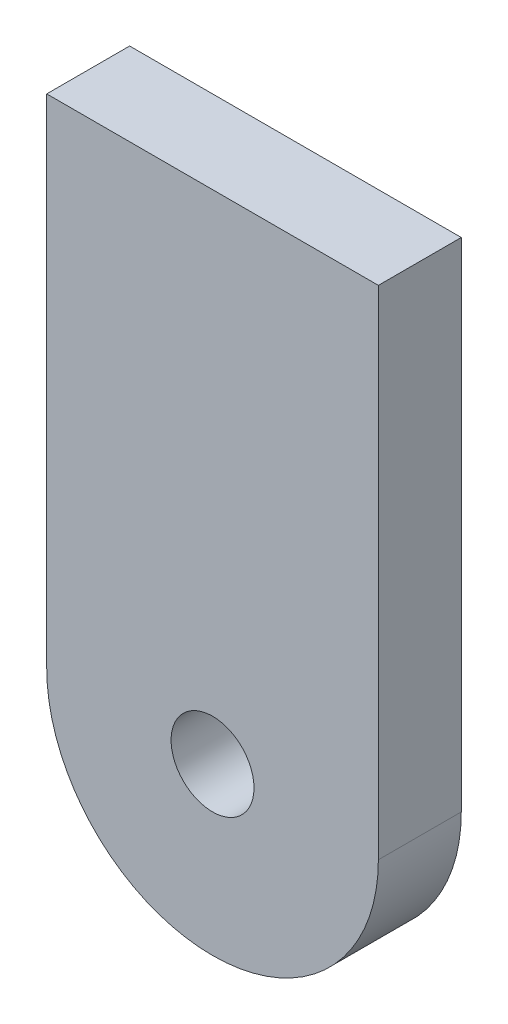
ISO-10303-21;
HEADER;
FILE_DESCRIPTION(('STEP AP214'),'2;1');
FILE_NAME('part.step','',(''),(''),'','','');
FILE_SCHEMA(('AUTOMOTIVE_DESIGN { 1 0 10303 214 1 1 1 1 }'));
ENDSEC;
DATA;
#1=APPLICATION_CONTEXT('core data for automotive mechanical design processes');
#2=APPLICATION_PROTOCOL_DEFINITION('international standard','automotive_design',2000,#1);
#3=PRODUCT_CONTEXT('',#1,'mechanical');
#4=PRODUCT('Part','Part','',(#3));
#5=PRODUCT_RELATED_PRODUCT_CATEGORY('part','',(#4));
#6=PRODUCT_DEFINITION_FORMATION('','',#4);
#7=PRODUCT_DEFINITION_CONTEXT('part definition',#1,'design');
#8=PRODUCT_DEFINITION('design','',#6,#7);
#9=PRODUCT_DEFINITION_SHAPE('','',#8);
#10=(LENGTH_UNIT() NAMED_UNIT(*) SI_UNIT(.MILLI.,.METRE.));
#11=(NAMED_UNIT(*) PLANE_ANGLE_UNIT() SI_UNIT($,.RADIAN.));
#12=(NAMED_UNIT(*) SI_UNIT($,.STERADIAN.) SOLID_ANGLE_UNIT());
#13=UNCERTAINTY_MEASURE_WITH_UNIT(LENGTH_MEASURE(1.E-05),#10,'distance_accuracy_value','');
#14=(GEOMETRIC_REPRESENTATION_CONTEXT(3) GLOBAL_UNCERTAINTY_ASSIGNED_CONTEXT((#13)) GLOBAL_UNIT_ASSIGNED_CONTEXT((#10,
#11,#12)) REPRESENTATION_CONTEXT('',''));
#15=CARTESIAN_POINT('',(0.,0.,0.));
#16=DIRECTION('',(0.,0.,1.));
#17=DIRECTION('',(1.,0.,0.));
#18=AXIS2_PLACEMENT_3D('',#15,#16,#17);
#19=CARTESIAN_POINT('',(0.,0.,2.5));
#20=DIRECTION('',(0.,0.,1.));
#21=DIRECTION('',(1.,0.,0.));
#22=AXIS2_PLACEMENT_3D('',#19,#20,#21);
#23=PLANE('',#22);
#24=CARTESIAN_POINT('',(0.,0.,2.5));
#25=DIRECTION('',(0.,0.,1.));
#26=DIRECTION('',(1.,0.,0.));
#27=AXIS2_PLACEMENT_3D('',#24,#25,#26);
#28=CIRCLE('',#27,10.);
#29=CARTESIAN_POINT('',(-10.,0.,2.5));
#30=VERTEX_POINT('',#29);
#31=CARTESIAN_POINT('',(10.,0.,2.5));
#32=VERTEX_POINT('',#31);
#33=EDGE_CURVE('E91',#30,#32,#28,.T.);
#34=ORIENTED_EDGE('',*,*,#33,.T.);
#35=DIRECTION('',(0.,1.,0.));
#36=VECTOR('',#35,1.);
#37=CARTESIAN_POINT('',(10.,0.,2.5));
#38=LINE('',#37,#36);
#39=CARTESIAN_POINT('',(10.,30.,2.5));
#40=VERTEX_POINT('',#39);
#41=EDGE_CURVE('E86',#32,#40,#38,.T.);
#42=ORIENTED_EDGE('',*,*,#41,.T.);
#43=DIRECTION('',(-1.,0.,0.));
#44=VECTOR('',#43,1.);
#45=CARTESIAN_POINT('',(10.,30.,2.5));
#46=LINE('',#45,#44);
#47=CARTESIAN_POINT('',(-10.,30.,2.5));
#48=VERTEX_POINT('',#47);
#49=EDGE_CURVE('E89',#40,#48,#46,.T.);
#50=ORIENTED_EDGE('',*,*,#49,.T.);
#51=DIRECTION('',(0.,-1.,0.));
#52=VECTOR('',#51,1.);
#53=CARTESIAN_POINT('',(-10.,0.,2.5));
#54=LINE('',#53,#52);
#55=EDGE_CURVE('E56',#48,#30,#54,.T.);
#56=ORIENTED_EDGE('',*,*,#55,.T.);
#57=EDGE_LOOP('',(#34,#42,#50,#56));
#58=FACE_BOUND('',#57,.T.);
#59=CARTESIAN_POINT('',(0.,0.,2.5));
#60=DIRECTION('',(0.,0.,1.));
#61=DIRECTION('',(1.,0.,0.));
#62=AXIS2_PLACEMENT_3D('',#59,#60,#61);
#63=CIRCLE('',#62,2.5);
#64=CARTESIAN_POINT('',(2.5,0.,2.5));
#65=VERTEX_POINT('',#64);
#66=EDGE_CURVE('E106',#65,#65,#63,.T.);
#67=ORIENTED_EDGE('',*,*,#66,.F.);
#68=EDGE_LOOP('',(#67));
#69=FACE_BOUND('',#68,.T.);
#70=ADVANCED_FACE('F39',(#58,#69),#23,.T.);
#71=CARTESIAN_POINT('',(0.,0.,-2.5));
#72=DIRECTION('',(0.,0.,1.));
#73=DIRECTION('',(1.,0.,0.));
#74=AXIS2_PLACEMENT_3D('',#71,#72,#73);
#75=PLANE('',#74);
#76=CARTESIAN_POINT('',(0.,0.,-2.5));
#77=DIRECTION('',(0.,0.,1.));
#78=DIRECTION('',(1.,0.,0.));
#79=AXIS2_PLACEMENT_3D('',#76,#77,#78);
#80=CIRCLE('',#79,10.);
#81=CARTESIAN_POINT('',(-10.,0.,-2.5));
#82=VERTEX_POINT('',#81);
#83=CARTESIAN_POINT('',(10.,0.,-2.5));
#84=VERTEX_POINT('',#83);
#85=EDGE_CURVE('E103',#82,#84,#80,.T.);
#86=ORIENTED_EDGE('',*,*,#85,.F.);
#87=DIRECTION('',(0.,-1.,0.));
#88=VECTOR('',#87,1.);
#89=CARTESIAN_POINT('',(-10.,0.,-2.5));
#90=LINE('',#89,#88);
#91=CARTESIAN_POINT('',(-10.,30.,-2.5));
#92=VERTEX_POINT('',#91);
#93=EDGE_CURVE('E79',#92,#82,#90,.T.);
#94=ORIENTED_EDGE('',*,*,#93,.F.);
#95=DIRECTION('',(-1.,0.,0.));
#96=VECTOR('',#95,1.);
#97=CARTESIAN_POINT('',(10.,30.,-2.5));
#98=LINE('',#97,#96);
#99=CARTESIAN_POINT('',(10.,30.,-2.5));
#100=VERTEX_POINT('',#99);
#101=EDGE_CURVE('E73',#100,#92,#98,.T.);
#102=ORIENTED_EDGE('',*,*,#101,.F.);
#103=DIRECTION('',(0.,1.,0.));
#104=VECTOR('',#103,1.);
#105=CARTESIAN_POINT('',(10.,0.,-2.5));
#106=LINE('',#105,#104);
#107=EDGE_CURVE('E95',#84,#100,#106,.T.);
#108=ORIENTED_EDGE('',*,*,#107,.F.);
#109=EDGE_LOOP('',(#86,#94,#102,#108));
#110=FACE_BOUND('',#109,.T.);
#111=CARTESIAN_POINT('',(0.,0.,-2.5));
#112=DIRECTION('',(0.,0.,1.));
#113=DIRECTION('',(1.,0.,0.));
#114=AXIS2_PLACEMENT_3D('',#111,#112,#113);
#115=CIRCLE('',#114,2.5);
#116=CARTESIAN_POINT('',(2.5,0.,-2.5));
#117=VERTEX_POINT('',#116);
#118=EDGE_CURVE('E118',#117,#117,#115,.T.);
#119=ORIENTED_EDGE('',*,*,#118,.T.);
#120=EDGE_LOOP('',(#119));
#121=FACE_BOUND('',#120,.T.);
#122=ADVANCED_FACE('F114',(#110,#121),#75,.F.);
#123=CARTESIAN_POINT('',(0.,0.,2.5));
#124=DIRECTION('',(0.,0.,-1.));
#125=DIRECTION('',(-1.,0.,0.));
#126=AXIS2_PLACEMENT_3D('',#123,#124,#125);
#127=CYLINDRICAL_SURFACE('',#126,10.);
#128=ORIENTED_EDGE('',*,*,#85,.T.);
#129=DIRECTION('',(0.,0.,-1.));
#130=VECTOR('',#129,1.);
#131=CARTESIAN_POINT('',(10.,0.,2.5));
#132=LINE('',#131,#130);
#133=EDGE_CURVE('E11',#32,#84,#132,.T.);
#134=ORIENTED_EDGE('',*,*,#133,.F.);
#135=ORIENTED_EDGE('',*,*,#33,.F.);
#136=DIRECTION('',(0.,0.,-1.));
#137=VECTOR('',#136,1.);
#138=CARTESIAN_POINT('',(-10.,0.,2.5));
#139=LINE('',#138,#137);
#140=EDGE_CURVE('E99',#30,#82,#139,.T.);
#141=ORIENTED_EDGE('',*,*,#140,.T.);
#142=EDGE_LOOP('',(#128,#134,#135,#141));
#143=FACE_BOUND('',#142,.T.);
#144=ADVANCED_FACE('F41',(#143),#127,.T.);
#145=CARTESIAN_POINT('',(10.,0.,2.5));
#146=DIRECTION('',(-1.,0.,0.));
#147=DIRECTION('',(0.,0.,1.));
#148=AXIS2_PLACEMENT_3D('',#145,#146,#147);
#149=PLANE('',#148);
#150=ORIENTED_EDGE('',*,*,#107,.T.);
#151=DIRECTION('',(0.,0.,-1.));
#152=VECTOR('',#151,1.);
#153=CARTESIAN_POINT('',(10.,30.,2.5));
#154=LINE('',#153,#152);
#155=EDGE_CURVE('E48',#40,#100,#154,.T.);
#156=ORIENTED_EDGE('',*,*,#155,.F.);
#157=ORIENTED_EDGE('',*,*,#41,.F.);
#158=ORIENTED_EDGE('',*,*,#133,.T.);
#159=EDGE_LOOP('',(#150,#156,#157,#158));
#160=FACE_BOUND('',#159,.T.);
#161=ADVANCED_FACE('F94',(#160),#149,.F.);
#162=CARTESIAN_POINT('',(10.,30.,2.5));
#163=DIRECTION('',(0.,-1.,0.));
#164=DIRECTION('',(0.,0.,-1.));
#165=AXIS2_PLACEMENT_3D('',#162,#163,#164);
#166=PLANE('',#165);
#167=ORIENTED_EDGE('',*,*,#101,.T.);
#168=DIRECTION('',(0.,0.,-1.));
#169=VECTOR('',#168,1.);
#170=CARTESIAN_POINT('',(-10.,30.,2.5));
#171=LINE('',#170,#169);
#172=EDGE_CURVE('E96',#48,#92,#171,.T.);
#173=ORIENTED_EDGE('',*,*,#172,.F.);
#174=ORIENTED_EDGE('',*,*,#49,.F.);
#175=ORIENTED_EDGE('',*,*,#155,.T.);
#176=EDGE_LOOP('',(#167,#173,#174,#175));
#177=FACE_BOUND('',#176,.T.);
#178=ADVANCED_FACE('F97',(#177),#166,.F.);
#179=CARTESIAN_POINT('',(-10.,0.,2.5));
#180=DIRECTION('',(1.,0.,0.));
#181=DIRECTION('',(0.,0.,-1.));
#182=AXIS2_PLACEMENT_3D('',#179,#180,#181);
#183=PLANE('',#182);
#184=ORIENTED_EDGE('',*,*,#93,.T.);
#185=ORIENTED_EDGE('',*,*,#140,.F.);
#186=ORIENTED_EDGE('',*,*,#55,.F.);
#187=ORIENTED_EDGE('',*,*,#172,.T.);
#188=EDGE_LOOP('',(#184,#185,#186,#187));
#189=FACE_BOUND('',#188,.T.);
#190=ADVANCED_FACE('F111',(#189),#183,.F.);
#191=CARTESIAN_POINT('',(0.,0.,2.5));
#192=DIRECTION('',(0.,0.,-1.));
#193=DIRECTION('',(-1.,0.,0.));
#194=AXIS2_PLACEMENT_3D('',#191,#192,#193);
#195=CYLINDRICAL_SURFACE('',#194,2.5);
#196=ORIENTED_EDGE('',*,*,#66,.T.);
#197=EDGE_LOOP('',(#196));
#198=FACE_BOUND('',#197,.T.);
#199=ORIENTED_EDGE('',*,*,#118,.F.);
#200=EDGE_LOOP('',(#199));
#201=FACE_BOUND('',#200,.T.);
#202=ADVANCED_FACE('F124',(#198,#201),#195,.F.);
#203=CLOSED_SHELL('',(#70,#122,#144,#161,#178,#190,#202));
#204=MANIFOLD_SOLID_BREP('B2',#203);
#205=ADVANCED_BREP_SHAPE_REPRESENTATION('',(#18,#204),#14);
#206=SHAPE_DEFINITION_REPRESENTATION(#9,#205);
ENDSEC;
END-ISO-10303-21;
